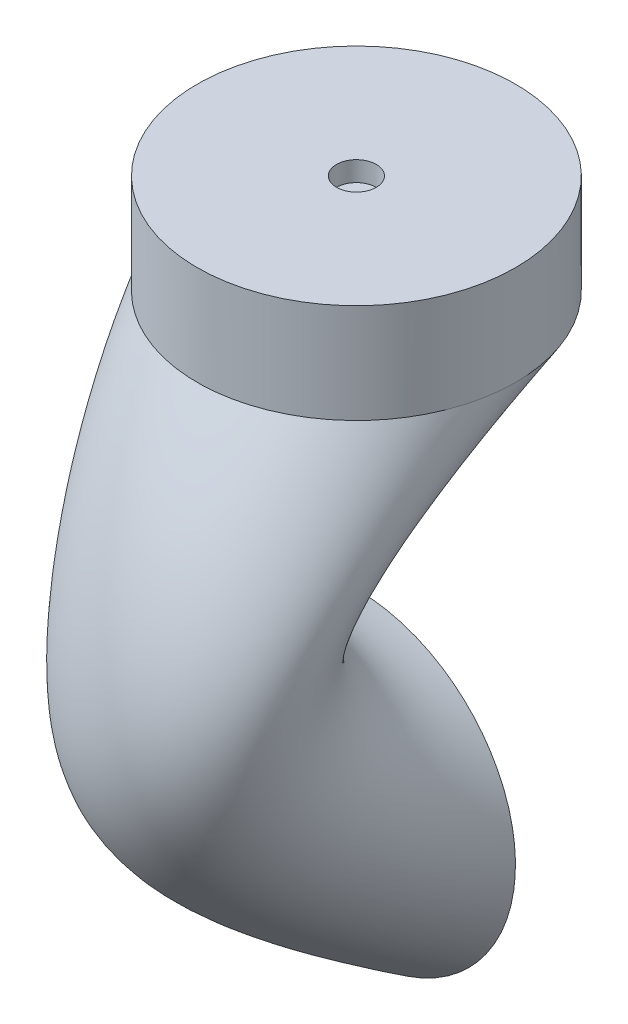
ISO-10303-21;
HEADER;
FILE_DESCRIPTION(('STEP AP214'),'2;1');
FILE_NAME('part.step','',(''),(''),'','','');
FILE_SCHEMA(('AUTOMOTIVE_DESIGN { 1 0 10303 214 1 1 1 1 }'));
ENDSEC;
DATA;
#1=APPLICATION_CONTEXT('core data for automotive mechanical design processes');
#2=APPLICATION_PROTOCOL_DEFINITION('international standard','automotive_design',2000,#1);
#3=PRODUCT_CONTEXT('',#1,'mechanical');
#4=PRODUCT('Part','Part','',(#3));
#5=PRODUCT_RELATED_PRODUCT_CATEGORY('part','',(#4));
#6=PRODUCT_DEFINITION_FORMATION('','',#4);
#7=PRODUCT_DEFINITION_CONTEXT('part definition',#1,'design');
#8=PRODUCT_DEFINITION('design','',#6,#7);
#9=PRODUCT_DEFINITION_SHAPE('','',#8);
#10=(LENGTH_UNIT() NAMED_UNIT(*) SI_UNIT(.MILLI.,.METRE.));
#11=(NAMED_UNIT(*) PLANE_ANGLE_UNIT() SI_UNIT($,.RADIAN.));
#12=(NAMED_UNIT(*) SI_UNIT($,.STERADIAN.) SOLID_ANGLE_UNIT());
#13=UNCERTAINTY_MEASURE_WITH_UNIT(LENGTH_MEASURE(1.E-05),#10,'distance_accuracy_value','');
#14=(GEOMETRIC_REPRESENTATION_CONTEXT(3) GLOBAL_UNCERTAINTY_ASSIGNED_CONTEXT((#13)) GLOBAL_UNIT_ASSIGNED_CONTEXT((#10,
#11,#12)) REPRESENTATION_CONTEXT('',''));
#15=CARTESIAN_POINT('',(0.,0.,0.));
#16=DIRECTION('',(0.,0.,1.));
#17=DIRECTION('',(1.,0.,0.));
#18=AXIS2_PLACEMENT_3D('',#15,#16,#17);
#19=CARTESIAN_POINT('',(0.,-4.46733336276805E-13,0.));
#20=DIRECTION('',(0.,0.,-1.));
#21=DIRECTION('',(0.,-1.,0.));
#22=AXIS2_PLACEMENT_3D('',#19,#20,#21);
#23=PLANE('',#22);
#24=CARTESIAN_POINT('',(0.,-4.46733336276805E-13,0.));
#25=DIRECTION('',(0.,0.,-1.));
#26=DIRECTION('',(0.,-1.,0.));
#27=AXIS2_PLACEMENT_3D('',#24,#25,#26);
#28=CIRCLE('',#27,10.);
#29=CARTESIAN_POINT('',(0.,-10.0000000000005,-1.11683334069201E-13));
#30=VERTEX_POINT('',#29);
#31=EDGE_CURVE('E113',#30,#30,#28,.T.);
#32=ORIENTED_EDGE('',*,*,#31,.F.);
#33=EDGE_LOOP('',(#32));
#34=FACE_BOUND('',#33,.T.);
#35=CARTESIAN_POINT('',(78.4955339615384,15.4418634915919,7.0425649685639E-13));
#36=CARTESIAN_POINT('',(78.2907679151548,16.4827495321157,7.13234964052697E-13));
#37=CARTESIAN_POINT('',(77.8407206554618,18.5521313295571,7.30908982546787E-13));
#38=CARTESIAN_POINT('',(77.0461181703535,21.6160053611403,7.60054772569215E-13));
#39=CARTESIAN_POINT('',(76.1339979948852,24.6366529143849,7.81441047041985E-13));
#40=CARTESIAN_POINT('',(69.9682542311678,42.4830124812616,9.25736023865264E-13));
#41=CARTESIAN_POINT('',(58.6786225704238,56.9641528622484,9.99556613219422E-13));
#42=CARTESIAN_POINT('',(26.9694972149722,78.2482931009689,1.00017757924526E-12));
#43=CARTESIAN_POINT('',(5.37585731888476,82.5908548892098,8.97962255102835E-13));
#44=CARTESIAN_POINT('',(-36.2595843020694,74.400213033866,5.17017899443933E-13));
#45=CARTESIAN_POINT('',(-54.59924839128,62.201858721029,2.64052619317342E-13));
#46=CARTESIAN_POINT('',(-78.2482931009694,26.9694972149717,-2.68849154160436E-13));
#47=CARTESIAN_POINT('',(-82.5908548892102,5.37585731888426,-5.28156599882207E-13));
#48=CARTESIAN_POINT('',(-74.4002130338665,-36.2595843020699,-9.08111969446202E-13));
#49=CARTESIAN_POINT('',(-62.2018587210295,-54.5992483912805,-1.01028145195596E-12));
#50=CARTESIAN_POINT('',(-26.9694972149722,-78.2482931009698,-1.01405536705307E-12));
#51=CARTESIAN_POINT('',(-5.37585731888471,-82.5908548892107,-9.11840042910649E-13));
#52=CARTESIAN_POINT('',(36.2595843020695,-74.400213033867,-5.30895687251747E-13));
#53=CARTESIAN_POINT('',(54.59924839128,-62.2018587210299,-2.77930407125156E-13));
#54=CARTESIAN_POINT('',(75.8833886300005,-30.4927333655783,2.03762857176016E-13));
#55=CARTESIAN_POINT('',(80.8464994463279,-12.814307508224,4.25770210177147E-13));
#56=CARTESIAN_POINT('',(79.7928337689043,6.03771452099855,6.12701531386341E-13));
#57=CARTESIAN_POINT('',(79.4928054067643,9.17877450726598,6.45300914050806E-13));
#58=CARTESIAN_POINT('',(79.0676426871096,12.3153257745923,6.7702648816705E-13));
#59=CARTESIAN_POINT('',(78.700300007922,14.400977451068,6.95278029660083E-13));
#60=CARTESIAN_POINT('',(78.4955339615384,15.4418634915919,7.0425649685639E-13));
#61=B_SPLINE_CURVE_WITH_KNOTS('',3,(#35,#36,#37,#38,#39,#40,#41,#42,#43,#44,#45,#46,#47,#48,#49,
#50,#51,#52,#53,#54,#55,#56,#57,#58,#59,#60),.UNSPECIFIED.,.T.,.F.,(4,1,1,1,1,2,2,2,2,2,2,2,1,1,
1,1,4),(0.,0.00624999999999998,0.0125,0.01875,0.025,0.125,0.25,0.375,0.5,0.625,0.75,0.875,0.975,
0.98125,0.9875,0.99375,1.),.UNSPECIFIED.);
#62=CARTESIAN_POINT('',(78.4955339615384,15.4418634915919,7.0425649685639E-13));
#63=VERTEX_POINT('',#62);
#64=EDGE_CURVE('E12',#63,#63,#61,.F.);
#65=ORIENTED_EDGE('',*,*,#64,.T.);
#66=EDGE_LOOP('',(#65));
#67=FACE_BOUND('',#66,.T.);
#68=ADVANCED_FACE('F88',(#34,#67),#23,.T.);
#69=CARTESIAN_POINT('',(4.26953224874635,210.,-79.8859880978921));
#70=CARTESIAN_POINT('',(6.37573600507708,186.807271695149,-13.845002570657));
#71=CARTESIAN_POINT('',(22.3330279391825,127.062307492511,67.9922264659235));
#72=CARTESIAN_POINT('',(55.8597371469385,57.1018473562097,39.4123228279382));
#73=CARTESIAN_POINT('',(78.4955339615384,15.4418634915919,7.0425649685639E-13));
#74=CARTESIAN_POINT('',(5.32885633571029,210.,-79.8293721823998));
#75=CARTESIAN_POINT('',(7.3848455216561,186.766492875109,-13.6034488796971));
#76=CARTESIAN_POINT('',(23.0586257549406,126.979133491042,68.3323173343438));
#77=CARTESIAN_POINT('',(56.2988064120176,56.3667365983178,39.6161103881339));
#78=CARTESIAN_POINT('',(78.700300007922,14.400977451068,6.95278029660083E-13));
#79=CARTESIAN_POINT('',(7.4409245517987,210.,-79.6742870118388));
#80=CARTESIAN_POINT('',(9.39382401630738,186.671257233245,-13.0851715052925));
#81=CARTESIAN_POINT('',(24.4961565311226,126.790503313795,69.0310345159487));
#82=CARTESIAN_POINT('',(57.1451330504067,54.8816699121542,40.0310344637983));
#83=CARTESIAN_POINT('',(79.0676426871096,12.3153257745923,6.7702648816705E-13));
#84=CARTESIAN_POINT('',(10.5860064546744,210.,-79.3176681467262));
#85=CARTESIAN_POINT('',(12.3770892631112,186.48827444093,-12.2072860160998));
#86=CARTESIAN_POINT('',(26.6117676871201,126.44480248367,70.1363572461497));
#87=CARTESIAN_POINT('',(58.3148849308851,52.6073850765589,40.6711414981793));
#88=CARTESIAN_POINT('',(79.4928054067643,9.17877450726598,6.45300914050806E-13));
#89=CARTESIAN_POINT('',(13.7047873885544,210.,-78.8386270818008));
#90=CARTESIAN_POINT('',(15.3265305085672,186.264931687906,-11.2303407919566));
#91=CARTESIAN_POINT('',(28.6844484988109,126.037150286756,71.2965022307962));
#92=CARTESIAN_POINT('',(59.3853456860524,50.2901686829155,41.3288009688682));
#93=CARTESIAN_POINT('',(79.7928337689043,6.03771452099855,6.12701531386341E-13));
#94=CARTESIAN_POINT('',(32.2399838914294,210.,-75.2392609501213));
#95=CARTESIAN_POINT('',(32.803497268246,184.691079525515,-4.78921385623697));
#96=CARTESIAN_POINT('',(40.8539571172303,123.224226568249,78.580830831401));
#97=CARTESIAN_POINT('',(65.2048526462554,36.1459166193519,45.3687467959835));
#98=CARTESIAN_POINT('',(80.8464994463279,-12.814307508224,4.25770210177147E-13));
#99=CARTESIAN_POINT('',(48.1625911498115,210.,-66.0943285903693));
#100=CARTESIAN_POINT('',(47.3044727116418,181.157118856768,5.85303637375658));
#101=CARTESIAN_POINT('',(50.1162587996097,117.800343161203,87.9229794706445));
#102=CARTESIAN_POINT('',(65.8947006087851,20.9118133542623,49.9736206882696));
#103=CARTESIAN_POINT('',(75.8833886300005,-30.4927333655783,2.03762857176016E-13));
#104=CARTESIAN_POINT('',(73.6873740633676,210.,-37.6871338375415));
#105=CARTESIAN_POINT('',(69.4750528247986,171.547040290359,33.9717930742111));
#106=CARTESIAN_POINT('',(62.6021549903168,101.56711650233,110.694152658222));
#107=CARTESIAN_POINT('',(56.6125154054687,-10.024844783511,59.0244257314052));
#108=CARTESIAN_POINT('',(54.59924839128,-62.2018587210299,-2.77930407125156E-13));
#109=CARTESIAN_POINT('',(81.0183064077395,210.,-16.9169494905302));
#110=CARTESIAN_POINT('',(74.7038666907098,164.7314430658,52.1794918112828));
#111=CARTESIAN_POINT('',(63.7365171388033,90.139515442589,124.130303895231));
#112=CARTESIAN_POINT('',(44.9621204357231,-24.8522071216984,63.5660586643158));
#113=CARTESIAN_POINT('',(36.2595843020695,-74.400213033867,-5.30895687251747E-13));
#114=CARTESIAN_POINT('',(78.7536697880491,209.999999999999,25.4560139880271));
#115=CARTESIAN_POINT('',(70.1633930269963,152.829124226096,86.7858813585257));
#116=CARTESIAN_POINT('',(53.2049248123838,66.1925028250277,146.230513905059));
#117=CARTESIAN_POINT('',(13.9796398069137,-42.2479375351229,69.7066048404939));
#118=CARTESIAN_POINT('',(-5.37585731888471,-82.5908548892107,-9.11840042910649E-13));
#119=CARTESIAN_POINT('',(69.2506835629079,209.999999999999,45.3265041594185));
#120=CARTESIAN_POINT('',(60.486688236293,147.742402610953,101.452283208542));
#121=CARTESIAN_POINT('',(41.7306749942459,55.082466652042,153.95764561862));
#122=CARTESIAN_POINT('',(-3.65030821649403,-44.4814562796126,71.3055180837613));
#123=CARTESIAN_POINT('',(-26.9694972149722,-78.2482931009698,-1.01405536705307E-12));
#124=CARTESIAN_POINT('',(37.6871338375436,209.999999999999,73.6873740633698));
#125=CARTESIAN_POINT('',(30.8342222154654,141.644185349764,120.377727995235));
#126=CARTESIAN_POINT('',(11.5333180524857,39.2235431262674,158.635489410775));
#127=CARTESIAN_POINT('',(-35.7682302227163,-34.6969834211691,71.1819076381558));
#128=CARTESIAN_POINT('',(-62.2018587210295,-54.5992483912805,-1.01028145195596E-12));
#129=CARTESIAN_POINT('',(16.9169494905324,209.999999999999,81.0183064077417));
#130=CARTESIAN_POINT('',(12.148840138553,140.63268970372,123.477323543723));
#131=CARTESIAN_POINT('',(-6.06670154151994,35.5801804213431,155.550547901434));
#132=CARTESIAN_POINT('',(-48.815836908398,-23.6458106504739,69.4593839492827));
#133=CARTESIAN_POINT('',(-74.4002130338665,-36.2595843020699,-9.08111969446202E-13));
#134=CARTESIAN_POINT('',(-25.4560139880249,209.999999999999,78.7536697880512));
#135=CARTESIAN_POINT('',(-25.7374708667229,144.468994385035,116.645019998695));
#136=CARTESIAN_POINT('',(-37.7388569337405,36.5173826925819,139.031480136721));
#137=CARTESIAN_POINT('',(-63.7407961034946,8.15834341710596,64.1483087959396));
#138=CARTESIAN_POINT('',(-82.5908548892102,5.37585731888426,-5.28156599882207E-13));
#139=CARTESIAN_POINT('',(-45.3265041594164,209.999999999999,69.25068356291));
#140=CARTESIAN_POINT('',(-43.2061108349319,149.316794712393,106.8057036441));
#141=CARTESIAN_POINT('',(-50.4144117726072,41.2520202344582,126.483859153004));
#142=CARTESIAN_POINT('',(-65.2832992821617,27.2091870783345,60.5597573314694));
#143=CARTESIAN_POINT('',(-78.2482931009694,26.9694972149717,-2.68849154160436E-13));
#144=CARTESIAN_POINT('',(-73.6873740633677,209.999999999999,37.6871338375457));
#145=CARTESIAN_POINT('',(-70.363662639222,160.093383750573,75.5966193083891));
#146=CARTESIAN_POINT('',(-61.6838416884326,59.2086074480479,101.139148946512));
#147=CARTESIAN_POINT('',(-57.5089163716358,61.6485620086338,50.5506873540493));
#148=CARTESIAN_POINT('',(-54.59924839128,62.201858721029,2.64052619317342E-13));
#149=CARTESIAN_POINT('',(-81.0183064077395,209.999999999999,16.9169494905344));
#150=CARTESIAN_POINT('',(-78.8931270871151,166.022172461394,55.5172304804854));
#151=CARTESIAN_POINT('',(-59.4257405613461,71.542923983918,89.6314210899614));
#152=CARTESIAN_POINT('',(-49.1588491146807,75.5967259805719,44.1301688410995));
#153=CARTESIAN_POINT('',(-36.2595843020694,74.400213033866,5.17017899443933E-13));
#154=CARTESIAN_POINT('',(-78.753669788049,210.,-25.4560139880228));
#155=CARTESIAN_POINT('',(-76.6976293520174,175.589396959869,18.1402798887298));
#156=CARTESIAN_POINT('',(-46.4932502315921,97.8786165718078,70.3783848392707));
#157=CARTESIAN_POINT('',(-20.5064078493825,90.6755553894083,35.2200511931089));
#158=CARTESIAN_POINT('',(5.37585731888476,82.5908548892098,8.97962255102835E-13));
#159=CARTESIAN_POINT('',(-69.2506835629078,210.,-45.3265041594142));
#160=CARTESIAN_POINT('',(-66.0652499079478,179.227832747523,2.57500708503261));
#161=CARTESIAN_POINT('',(-36.0105656856928,110.470617238993,63.5700035043896));
#162=CARTESIAN_POINT('',(-1.90617147669554,91.471371495559,32.7304520580682));
#163=CARTESIAN_POINT('',(26.9694972149722,78.2482931009689,1.00017757924526E-12));
#164=CARTESIAN_POINT('',(-40.8434888100798,210.,-70.8512870729704));
#165=CARTESIAN_POINT('',(-37.2085332385763,184.712138713568,-14.484288377057));
#166=CARTESIAN_POINT('',(-11.0377707033163,124.770268977459,59.3969621665133));
#167=CARTESIAN_POINT('',(29.1297080182937,82.6258326104878,32.7996825781836));
#168=CARTESIAN_POINT('',(58.6786225704238,56.9641528622484,9.99556613219422E-13));
#169=CARTESIAN_POINT('',(-24.0368617274562,210.,-78.2469950089791));
#170=CARTESIAN_POINT('',(-20.7877999157621,186.8996624491,-17.6118797893512));
#171=CARTESIAN_POINT('',(2.2971800203529,127.610655740922,60.5038207768334));
#172=CARTESIAN_POINT('',(41.882595093557,75.2234064119165,34.5514559321092));
#173=CARTESIAN_POINT('',(69.9682542311678,42.4830124812616,9.25736023865264E-13));
#174=CARTESIAN_POINT('',(-5.22360886715542,210.,-79.8502612889382));
#175=CARTESIAN_POINT('',(-2.70151830973712,186.998055084677,-15.5487543726473));
#176=CARTESIAN_POINT('',(15.7198899974957,127.523455836092,65.2221939518574));
#177=CARTESIAN_POINT('',(51.5368661970735,63.4224166683966,37.6848010728296));
#178=CARTESIAN_POINT('',(76.1339979948852,24.6366529143849,7.81441047041985E-13));
#179=CARTESIAN_POINT('',(-2.0715350106808,210.,-79.9941545088897));
#180=CARTESIAN_POINT('',(0.320666994414746,186.977067762833,-15.0955909939025));
#181=CARTESIAN_POINT('',(17.9431280701441,127.44003706815,66.0749884287386));
#182=CARTESIAN_POINT('',(53.0658131592782,61.3878049105261,38.2338350039995));
#183=CARTESIAN_POINT('',(77.0461181703535,21.6160053611403,7.60054772569215E-13));
#184=CARTESIAN_POINT('',(1.09364147481592,210.,-80.0135195910978));
#185=CARTESIAN_POINT('',(3.34782836163414,186.915930153486,-14.534030737357));
#186=CARTESIAN_POINT('',(20.1495525413705,127.29031768544,66.9949218317854));
#187=CARTESIAN_POINT('',(54.5123917065856,59.2838237713275,38.8083091026242));
#188=CARTESIAN_POINT('',(77.8407206554618,18.5521313295571,7.30908982546787E-13));
#189=CARTESIAN_POINT('',(3.21020816178243,210.,-79.9426040133844));
#190=CARTESIAN_POINT('',(5.36662648849808,186.848050515189,-14.0865562616168));
#191=CARTESIAN_POINT('',(21.6074301234244,127.14548149398,67.6521355975033));
#192=CARTESIAN_POINT('',(55.4206678818593,57.8369581141016,39.2085352677425));
#193=CARTESIAN_POINT('',(78.2907679151548,16.4827495321157,7.13234964052697E-13));
#194=CARTESIAN_POINT('',(4.26953224874635,210.,-79.8859880978921));
#195=CARTESIAN_POINT('',(6.37573600507708,186.807271695149,-13.845002570657));
#196=CARTESIAN_POINT('',(22.3330279391825,127.062307492511,67.9922264659235));
#197=CARTESIAN_POINT('',(55.8597371469385,57.1018473562097,39.4123228279382));
#198=CARTESIAN_POINT('',(78.4955339615384,15.4418634915919,7.0425649685639E-13));
#199=B_SPLINE_SURFACE_WITH_KNOTS('',3,3,((#69,#70,#71,#72,#73),(#74,#75,#76,#77,#78),(#79,#80,
#81,#82,#83),(#84,#85,#86,#87,#88),(#89,#90,#91,#92,#93),(#94,#95,#96,#97,#98),(#99,#100,#101,
#102,#103),(#104,#105,#106,#107,#108),(#109,#110,#111,#112,#113),(#114,#115,#116,#117,#118),
(#119,#120,#121,#122,#123),(#124,#125,#126,#127,#128),(#129,#130,#131,#132,#133),(#134,#135,
#136,#137,#138),(#139,#140,#141,#142,#143),(#144,#145,#146,#147,#148),(#149,#150,#151,#152,
#153),(#154,#155,#156,#157,#158),(#159,#160,#161,#162,#163),(#164,#165,#166,#167,#168),(#169,
#170,#171,#172,#173),(#174,#175,#176,#177,#178),(#179,#180,#181,#182,#183),(#184,#185,#186,#187,
#188),(#189,#190,#191,#192,#193),(#194,#195,#196,#197,#198)),.UNSPECIFIED.,.T.,.F.,.F.,(4,1,1,1,
1,2,2,2,2,2,2,2,1,1,1,1,4),(4,1,4),(0.,0.00625000000000009,0.0125,0.01875,0.0249999999999999,
0.125,0.25,0.375,0.5,0.625,0.75,0.875,0.975,0.98125,0.9875,0.99375,1.),(0.,0.558625064637589,
1.),.UNSPECIFIED.);
#200=CARTESIAN_POINT('',(4.26953224874635,210.,-79.8859880978921));
#201=CARTESIAN_POINT('',(5.32885633571029,210.,-79.8293721823998));
#202=CARTESIAN_POINT('',(7.4409245517987,210.,-79.6742870118388));
#203=CARTESIAN_POINT('',(10.5860064546744,210.,-79.3176681467262));
#204=CARTESIAN_POINT('',(13.7047873885544,210.,-78.8386270818008));
#205=CARTESIAN_POINT('',(32.2399838914294,210.,-75.2392609501213));
#206=CARTESIAN_POINT('',(48.1625911498115,210.,-66.0943285903693));
#207=CARTESIAN_POINT('',(73.6873740633676,210.,-37.6871338375415));
#208=CARTESIAN_POINT('',(81.0183064077395,210.,-16.9169494905302));
#209=CARTESIAN_POINT('',(78.7536697880491,209.999999999999,25.4560139880271));
#210=CARTESIAN_POINT('',(69.2506835629079,209.999999999999,45.3265041594185));
#211=CARTESIAN_POINT('',(37.6871338375436,209.999999999999,73.6873740633698));
#212=CARTESIAN_POINT('',(16.9169494905324,209.999999999999,81.0183064077417));
#213=CARTESIAN_POINT('',(-25.4560139880249,209.999999999999,78.7536697880512));
#214=CARTESIAN_POINT('',(-45.3265041594164,209.999999999999,69.25068356291));
#215=CARTESIAN_POINT('',(-73.6873740633677,209.999999999999,37.6871338375457));
#216=CARTESIAN_POINT('',(-81.0183064077395,209.999999999999,16.9169494905344));
#217=CARTESIAN_POINT('',(-78.753669788049,210.,-25.4560139880228));
#218=CARTESIAN_POINT('',(-69.2506835629078,210.,-45.3265041594142));
#219=CARTESIAN_POINT('',(-40.8434888100798,210.,-70.8512870729704));
#220=CARTESIAN_POINT('',(-24.0368617274562,210.,-78.2469950089791));
#221=CARTESIAN_POINT('',(-5.22360886715542,210.,-79.8502612889382));
#222=CARTESIAN_POINT('',(-2.0715350106808,210.,-79.9941545088897));
#223=CARTESIAN_POINT('',(1.09364147481592,210.,-80.0135195910978));
#224=CARTESIAN_POINT('',(3.21020816178243,210.,-79.9426040133844));
#225=CARTESIAN_POINT('',(4.26953224874635,210.,-79.8859880978921));
#226=B_SPLINE_CURVE_WITH_KNOTS('',3,(#200,#201,#202,#203,#204,#205,#206,#207,#208,#209,#210,
#211,#212,#213,#214,#215,#216,#217,#218,#219,#220,#221,#222,#223,#224,#225),.UNSPECIFIED.,.T.,
.F.,(4,1,1,1,1,2,2,2,2,2,2,2,1,1,1,1,4),(0.,0.00625000000000009,0.0125,0.01875,
0.0249999999999999,0.125,0.25,0.375,0.5,0.625,0.75,0.875,0.975,0.98125,0.9875,0.99375,1.),.UNSPECIFIED.);
#227=CARTESIAN_POINT('',(4.26953224874635,210.,-79.8859880978921));
#228=VERTEX_POINT('',#227);
#229=EDGE_CURVE('E125',#228,#228,#226,.T.);
#230=ORIENTED_EDGE('',*,*,#229,.T.);
#231=EDGE_LOOP('',(#230));
#232=FACE_BOUND('',#231,.T.);
#233=ORIENTED_EDGE('',*,*,#64,.F.);
#234=EDGE_LOOP('',(#233));
#235=FACE_BOUND('',#234,.T.);
#236=ADVANCED_FACE('F126',(#232,#235),#199,.T.);
#237=CARTESIAN_POINT('',(0.,-5.51477776442099E-13,9.99999999999999));
#238=DIRECTION('',(0.,0.,-1.));
#239=DIRECTION('',(0.,-1.,0.));
#240=AXIS2_PLACEMENT_3D('',#237,#238,#239);
#241=CYLINDRICAL_SURFACE('',#240,10.);
#242=CARTESIAN_POINT('',(0.,-5.51477776442099E-13,9.99999999999999));
#243=DIRECTION('',(0.,0.,-1.));
#244=DIRECTION('',(0.,-1.,0.));
#245=AXIS2_PLACEMENT_3D('',#242,#243,#244);
#246=CIRCLE('',#245,10.);
#247=CARTESIAN_POINT('',(0.,-10.0000000000006,9.99999999999989));
#248=VERTEX_POINT('',#247);
#249=EDGE_CURVE('E110',#248,#248,#246,.T.);
#250=ORIENTED_EDGE('',*,*,#249,.F.);
#251=EDGE_LOOP('',(#250));
#252=FACE_BOUND('',#251,.T.);
#253=ORIENTED_EDGE('',*,*,#31,.T.);
#254=EDGE_LOOP('',(#253));
#255=FACE_BOUND('',#254,.T.);
#256=ADVANCED_FACE('F139',(#252,#255),#241,.F.);
#257=CARTESIAN_POINT('',(0.,-5.51477776442099E-13,9.99999999999999));
#258=DIRECTION('',(0.,0.,-1.));
#259=DIRECTION('',(0.,-1.,0.));
#260=AXIS2_PLACEMENT_3D('',#257,#258,#259);
#261=PLANE('',#260);
#262=ORIENTED_EDGE('',*,*,#249,.T.);
#263=EDGE_LOOP('',(#262));
#264=FACE_BOUND('',#263,.T.);
#265=ADVANCED_FACE('F195',(#264),#261,.T.);
#266=CARTESIAN_POINT('',(0.,259.999999999999,2.71310751642773E-12));
#267=DIRECTION('',(0.,-1.,0.));
#268=DIRECTION('',(-1.,0.,0.));
#269=AXIS2_PLACEMENT_3D('',#266,#267,#268);
#270=CYLINDRICAL_SURFACE('',#269,80.);
#271=CARTESIAN_POINT('',(0.,259.999999999999,2.71310751642773E-12));
#272=DIRECTION('',(0.,1.,0.));
#273=DIRECTION('',(1.,0.,0.));
#274=AXIS2_PLACEMENT_3D('',#271,#272,#273);
#275=CIRCLE('',#274,80.);
#276=CARTESIAN_POINT('',(80.,259.999999999999,3.27174453064263E-12));
#277=VERTEX_POINT('',#276);
#278=EDGE_CURVE('E118',#277,#277,#275,.T.);
#279=ORIENTED_EDGE('',*,*,#278,.F.);
#280=EDGE_LOOP('',(#279));
#281=FACE_BOUND('',#280,.T.);
#282=ORIENTED_EDGE('',*,*,#229,.F.);
#283=EDGE_LOOP('',(#282));
#284=FACE_BOUND('',#283,.T.);
#285=ADVANCED_FACE('F144',(#281,#284),#270,.T.);
#286=CARTESIAN_POINT('',(0.,259.999999999999,2.71310751642773E-12));
#287=DIRECTION('',(0.,1.,0.));
#288=DIRECTION('',(1.,0.,0.));
#289=AXIS2_PLACEMENT_3D('',#286,#287,#288);
#290=PLANE('',#289);
#291=CARTESIAN_POINT('',(0.,259.999999999999,2.71310751642773E-12));
#292=DIRECTION('',(0.,1.,0.));
#293=DIRECTION('',(1.,0.,0.));
#294=AXIS2_PLACEMENT_3D('',#291,#292,#293);
#295=CIRCLE('',#294,10.);
#296=CARTESIAN_POINT('',(10.,259.999999999999,2.78293714320459E-12));
#297=VERTEX_POINT('',#296);
#298=EDGE_CURVE('E297',#297,#297,#295,.T.);
#299=ORIENTED_EDGE('',*,*,#298,.F.);
#300=EDGE_LOOP('',(#299));
#301=FACE_BOUND('',#300,.T.);
#302=ORIENTED_EDGE('',*,*,#278,.T.);
#303=EDGE_LOOP('',(#302));
#304=FACE_BOUND('',#303,.T.);
#305=ADVANCED_FACE('F187',(#301,#304),#290,.T.);
#306=CARTESIAN_POINT('',(0.,250.,2.60902410786912E-12));
#307=DIRECTION('',(0.,1.,0.));
#308=DIRECTION('',(1.,0.,0.));
#309=AXIS2_PLACEMENT_3D('',#306,#307,#308);
#310=CYLINDRICAL_SURFACE('',#309,10.);
#311=CARTESIAN_POINT('',(0.,250.,2.60902410786912E-12));
#312=DIRECTION('',(0.,1.,0.));
#313=DIRECTION('',(1.,0.,0.));
#314=AXIS2_PLACEMENT_3D('',#311,#312,#313);
#315=CIRCLE('',#314,10.);
#316=CARTESIAN_POINT('',(10.,250.,2.67885373464598E-12));
#317=VERTEX_POINT('',#316);
#318=EDGE_CURVE('E300',#317,#317,#315,.T.);
#319=ORIENTED_EDGE('',*,*,#318,.F.);
#320=EDGE_LOOP('',(#319));
#321=FACE_BOUND('',#320,.T.);
#322=ORIENTED_EDGE('',*,*,#298,.T.);
#323=EDGE_LOOP('',(#322));
#324=FACE_BOUND('',#323,.T.);
#325=ADVANCED_FACE('F145',(#321,#324),#310,.F.);
#326=CARTESIAN_POINT('',(0.,250.,2.60902410786912E-12));
#327=DIRECTION('',(0.,1.,0.));
#328=DIRECTION('',(1.,0.,0.));
#329=AXIS2_PLACEMENT_3D('',#326,#327,#328);
#330=PLANE('',#329);
#331=ORIENTED_EDGE('',*,*,#318,.T.);
#332=EDGE_LOOP('',(#331));
#333=FACE_BOUND('',#332,.T.);
#334=ADVANCED_FACE('F227',(#333),#330,.T.);
#335=CLOSED_SHELL('',(#68,#236,#256,#265,#285,#305,#325,#334));
#336=CARTESIAN_POINT('',(0.,200.,2.08860706507608E-12));
#337=DIRECTION('',(0.,1.,0.));
#338=DIRECTION('',(1.,0.,0.));
#339=AXIS2_PLACEMENT_3D('',#336,#337,#338);
#340=PLANE('',#339);
#341=CARTESIAN_POINT('',(0.,200.,2.08860706507608E-12));
#342=DIRECTION('',(0.,1.,0.));
#343=DIRECTION('',(1.,0.,0.));
#344=AXIS2_PLACEMENT_3D('',#341,#342,#343);
#345=CIRCLE('',#344,10.);
#346=CARTESIAN_POINT('',(10.,200.,2.15843669185294E-12));
#347=VERTEX_POINT('',#346);
#348=EDGE_CURVE('E100',#347,#347,#345,.T.);
#349=ORIENTED_EDGE('',*,*,#348,.T.);
#350=EDGE_LOOP('',(#349));
#351=FACE_BOUND('',#350,.T.);
#352=ADVANCED_FACE('F197',(#351),#340,.T.);
#353=CARTESIAN_POINT('',(0.,200.,2.08860706507608E-12));
#354=DIRECTION('',(0.,1.,0.));
#355=DIRECTION('',(1.,0.,0.));
#356=AXIS2_PLACEMENT_3D('',#353,#354,#355);
#357=CYLINDRICAL_SURFACE('',#356,10.);
#358=ORIENTED_EDGE('',*,*,#348,.F.);
#359=EDGE_LOOP('',(#358));
#360=FACE_BOUND('',#359,.T.);
#361=CARTESIAN_POINT('',(0.,210.,2.19269047363468E-12));
#362=DIRECTION('',(0.,1.,0.));
#363=DIRECTION('',(1.,0.,0.));
#364=AXIS2_PLACEMENT_3D('',#361,#362,#363);
#365=CIRCLE('',#364,10.);
#366=CARTESIAN_POINT('',(10.,210.,2.26252010041155E-12));
#367=VERTEX_POINT('',#366);
#368=EDGE_CURVE('E93',#367,#367,#365,.T.);
#369=ORIENTED_EDGE('',*,*,#368,.T.);
#370=EDGE_LOOP('',(#369));
#371=FACE_BOUND('',#370,.T.);
#372=ADVANCED_FACE('F198',(#360,#371),#357,.F.);
#373=CARTESIAN_POINT('',(0.,210.,2.19269047363468E-12));
#374=DIRECTION('',(0.,1.,0.));
#375=DIRECTION('',(1.,0.,0.));
#376=AXIS2_PLACEMENT_3D('',#373,#374,#375);
#377=PLANE('',#376);
#378=ORIENTED_EDGE('',*,*,#368,.F.);
#379=EDGE_LOOP('',(#378));
#380=FACE_BOUND('',#379,.T.);
#381=ADVANCED_FACE('F91',(#380),#377,.F.);
#382=CLOSED_SHELL('',(#352,#372,#381));
#383=ORIENTED_CLOSED_SHELL('',*,#382,.T.);
#384=BREP_WITH_VOIDS('B2',#335,(#383));
#385=ADVANCED_BREP_SHAPE_REPRESENTATION('',(#18,#384),#14);
#386=SHAPE_DEFINITION_REPRESENTATION(#9,#385);
ENDSEC;
END-ISO-10303-21;
